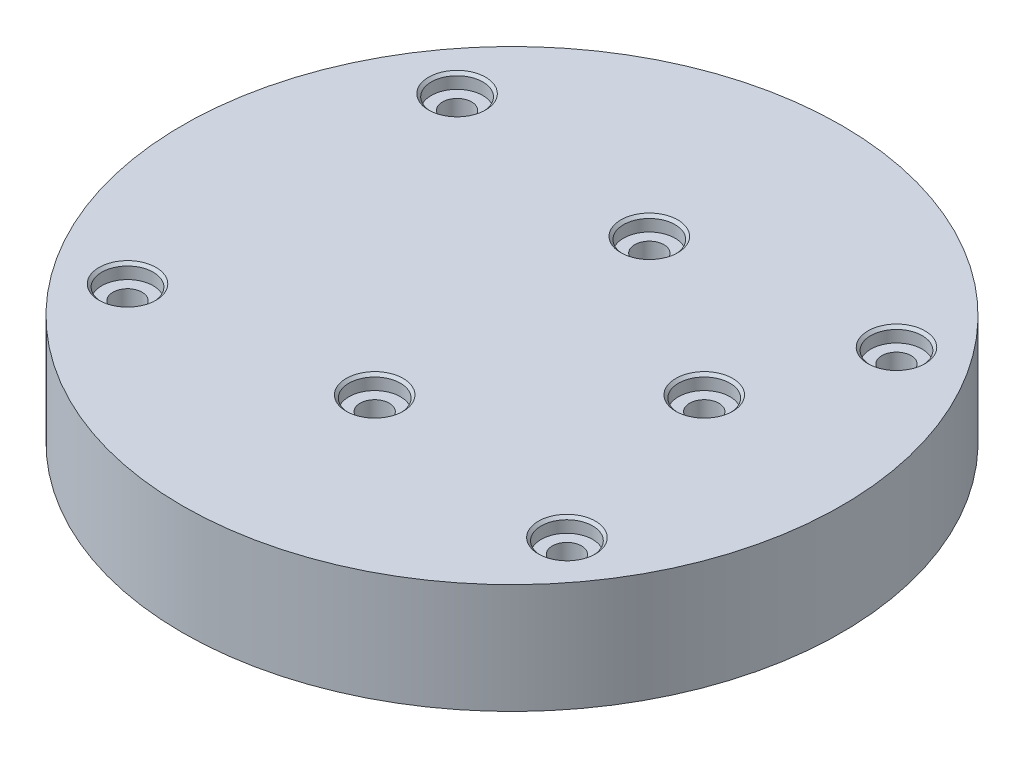
ISO-10303-21;
HEADER;
FILE_DESCRIPTION(('STEP AP214'),'2;1');
FILE_NAME('part.step','',(''),(''),'','','');
FILE_SCHEMA(('AUTOMOTIVE_DESIGN { 1 0 10303 214 1 1 1 1 }'));
ENDSEC;
DATA;
#1=APPLICATION_CONTEXT('core data for automotive mechanical design processes');
#2=APPLICATION_PROTOCOL_DEFINITION('international standard','automotive_design',2000,#1);
#3=PRODUCT_CONTEXT('',#1,'mechanical');
#4=PRODUCT('Part','Part','',(#3));
#5=PRODUCT_RELATED_PRODUCT_CATEGORY('part','',(#4));
#6=PRODUCT_DEFINITION_FORMATION('','',#4);
#7=PRODUCT_DEFINITION_CONTEXT('part definition',#1,'design');
#8=PRODUCT_DEFINITION('design','',#6,#7);
#9=PRODUCT_DEFINITION_SHAPE('','',#8);
#10=(LENGTH_UNIT() NAMED_UNIT(*) SI_UNIT(.MILLI.,.METRE.));
#11=(NAMED_UNIT(*) PLANE_ANGLE_UNIT() SI_UNIT($,.RADIAN.));
#12=(NAMED_UNIT(*) SI_UNIT($,.STERADIAN.) SOLID_ANGLE_UNIT());
#13=UNCERTAINTY_MEASURE_WITH_UNIT(LENGTH_MEASURE(1.E-05),#10,'distance_accuracy_value','');
#14=(GEOMETRIC_REPRESENTATION_CONTEXT(3) GLOBAL_UNCERTAINTY_ASSIGNED_CONTEXT((#13)) GLOBAL_UNIT_ASSIGNED_CONTEXT((#10,
#11,#12)) REPRESENTATION_CONTEXT('',''));
#15=CARTESIAN_POINT('',(0.,0.,0.));
#16=DIRECTION('',(0.,0.,1.));
#17=DIRECTION('',(1.,0.,0.));
#18=AXIS2_PLACEMENT_3D('',#15,#16,#17);
#19=CARTESIAN_POINT('',(0.,-25.4,0.));
#20=DIRECTION('',(0.,1.,0.));
#21=DIRECTION('',(0.,0.,1.));
#22=AXIS2_PLACEMENT_3D('',#19,#20,#21);
#23=CYLINDRICAL_SURFACE('',#22,76.2);
#24=CARTESIAN_POINT('',(0.,-25.4,0.));
#25=DIRECTION('',(0.,1.,0.));
#26=DIRECTION('',(0.,0.,1.));
#27=AXIS2_PLACEMENT_3D('',#24,#25,#26);
#28=CIRCLE('',#27,76.2);
#29=CARTESIAN_POINT('',(0.,-25.4,76.2));
#30=VERTEX_POINT('',#29);
#31=EDGE_CURVE('E10',#30,#30,#28,.T.);
#32=ORIENTED_EDGE('',*,*,#31,.T.);
#33=EDGE_LOOP('',(#32));
#34=FACE_BOUND('',#33,.T.);
#35=CARTESIAN_POINT('',(0.,0.,0.));
#36=DIRECTION('',(0.,1.,0.));
#37=DIRECTION('',(0.,0.,1.));
#38=AXIS2_PLACEMENT_3D('',#35,#36,#37);
#39=CIRCLE('',#38,76.2);
#40=CARTESIAN_POINT('',(0.,0.,76.2));
#41=VERTEX_POINT('',#40);
#42=EDGE_CURVE('E38',#41,#41,#39,.T.);
#43=ORIENTED_EDGE('',*,*,#42,.F.);
#44=EDGE_LOOP('',(#43));
#45=FACE_BOUND('',#44,.T.);
#46=ADVANCED_FACE('F35',(#34,#45),#23,.T.);
#47=CARTESIAN_POINT('',(0.,-25.4,0.));
#48=DIRECTION('',(0.,1.,0.));
#49=DIRECTION('',(0.,0.,1.));
#50=AXIS2_PLACEMENT_3D('',#47,#48,#49);
#51=PLANE('',#50);
#52=CARTESIAN_POINT('',(0.,-25.4,-31.75));
#53=DIRECTION('',(0.,1.,0.));
#54=DIRECTION('',(0.,0.,1.));
#55=AXIS2_PLACEMENT_3D('',#52,#53,#54);
#56=CIRCLE('',#55,3.3782);
#57=CARTESIAN_POINT('',(0.,-25.4,-28.3718));
#58=VERTEX_POINT('',#57);
#59=EDGE_CURVE('E136',#58,#58,#56,.T.);
#60=ORIENTED_EDGE('',*,*,#59,.T.);
#61=EDGE_LOOP('',(#60));
#62=FACE_BOUND('',#61,.T.);
#63=CARTESIAN_POINT('',(38.1,-25.4,-6.35));
#64=DIRECTION('',(0.,1.,0.));
#65=DIRECTION('',(0.,0.,1.));
#66=AXIS2_PLACEMENT_3D('',#63,#64,#65);
#67=CIRCLE('',#66,3.3782);
#68=CARTESIAN_POINT('',(38.1,-25.4,-2.9718));
#69=VERTEX_POINT('',#68);
#70=EDGE_CURVE('E121',#69,#69,#67,.T.);
#71=ORIENTED_EDGE('',*,*,#70,.T.);
#72=EDGE_LOOP('',(#71));
#73=FACE_BOUND('',#72,.T.);
#74=CARTESIAN_POINT('',(0.,-25.4,31.75));
#75=DIRECTION('',(0.,1.,0.));
#76=DIRECTION('',(0.,0.,1.));
#77=AXIS2_PLACEMENT_3D('',#74,#75,#76);
#78=CIRCLE('',#77,3.3782);
#79=CARTESIAN_POINT('',(0.,-25.4,35.1282));
#80=VERTEX_POINT('',#79);
#81=EDGE_CURVE('E106',#80,#80,#78,.T.);
#82=ORIENTED_EDGE('',*,*,#81,.T.);
#83=EDGE_LOOP('',(#82));
#84=FACE_BOUND('',#83,.T.);
#85=CARTESIAN_POINT('',(50.8,-25.4,38.1));
#86=DIRECTION('',(0.,1.,0.));
#87=DIRECTION('',(0.,0.,1.));
#88=AXIS2_PLACEMENT_3D('',#85,#86,#87);
#89=CIRCLE('',#88,3.3782);
#90=CARTESIAN_POINT('',(50.8,-25.4,41.4782));
#91=VERTEX_POINT('',#90);
#92=EDGE_CURVE('E91',#91,#91,#89,.T.);
#93=ORIENTED_EDGE('',*,*,#92,.T.);
#94=EDGE_LOOP('',(#93));
#95=FACE_BOUND('',#94,.T.);
#96=CARTESIAN_POINT('',(50.8,-25.4,-38.1));
#97=DIRECTION('',(0.,1.,0.));
#98=DIRECTION('',(0.,0.,1.));
#99=AXIS2_PLACEMENT_3D('',#96,#97,#98);
#100=CIRCLE('',#99,3.3782);
#101=CARTESIAN_POINT('',(50.8,-25.4,-34.7218));
#102=VERTEX_POINT('',#101);
#103=EDGE_CURVE('E76',#102,#102,#100,.T.);
#104=ORIENTED_EDGE('',*,*,#103,.T.);
#105=EDGE_LOOP('',(#104));
#106=FACE_BOUND('',#105,.T.);
#107=CARTESIAN_POINT('',(-50.8,-25.4,-38.1));
#108=DIRECTION('',(0.,1.,0.));
#109=DIRECTION('',(0.,0.,1.));
#110=AXIS2_PLACEMENT_3D('',#107,#108,#109);
#111=CIRCLE('',#110,3.3782);
#112=CARTESIAN_POINT('',(-50.8,-25.4,-34.7218));
#113=VERTEX_POINT('',#112);
#114=EDGE_CURVE('E61',#113,#113,#111,.T.);
#115=ORIENTED_EDGE('',*,*,#114,.T.);
#116=EDGE_LOOP('',(#115));
#117=FACE_BOUND('',#116,.T.);
#118=CARTESIAN_POINT('',(-50.8,-25.4,38.1));
#119=DIRECTION('',(0.,1.,0.));
#120=DIRECTION('',(0.,0.,1.));
#121=AXIS2_PLACEMENT_3D('',#118,#119,#120);
#122=CIRCLE('',#121,3.3782);
#123=CARTESIAN_POINT('',(-50.8,-25.4,41.4782));
#124=VERTEX_POINT('',#123);
#125=EDGE_CURVE('E45',#124,#124,#122,.T.);
#126=ORIENTED_EDGE('',*,*,#125,.T.);
#127=EDGE_LOOP('',(#126));
#128=FACE_BOUND('',#127,.T.);
#129=ORIENTED_EDGE('',*,*,#31,.F.);
#130=EDGE_LOOP('',(#129));
#131=FACE_BOUND('',#130,.T.);
#132=ADVANCED_FACE('F158',(#62,#73,#84,#95,#106,#117,#128,#131),#51,.F.);
#133=CARTESIAN_POINT('',(0.,0.,0.));
#134=DIRECTION('',(0.,1.,0.));
#135=DIRECTION('',(0.,0.,1.));
#136=AXIS2_PLACEMENT_3D('',#133,#134,#135);
#137=PLANE('',#136);
#138=CARTESIAN_POINT('',(0.,0.,-31.75));
#139=DIRECTION('',(0.,1.,0.));
#140=DIRECTION('',(0.,0.,1.));
#141=AXIS2_PLACEMENT_3D('',#138,#139,#140);
#142=CIRCLE('',#141,6.58876);
#143=CARTESIAN_POINT('',(0.,0.,-25.16124));
#144=VERTEX_POINT('',#143);
#145=EDGE_CURVE('E148',#144,#144,#142,.T.);
#146=ORIENTED_EDGE('',*,*,#145,.F.);
#147=EDGE_LOOP('',(#146));
#148=FACE_BOUND('',#147,.T.);
#149=CARTESIAN_POINT('',(38.1,0.,-6.35));
#150=DIRECTION('',(0.,1.,0.));
#151=DIRECTION('',(0.,0.,1.));
#152=AXIS2_PLACEMENT_3D('',#149,#150,#151);
#153=CIRCLE('',#152,6.58876);
#154=CARTESIAN_POINT('',(38.1,0.,0.238759999999998));
#155=VERTEX_POINT('',#154);
#156=EDGE_CURVE('E133',#155,#155,#153,.T.);
#157=ORIENTED_EDGE('',*,*,#156,.F.);
#158=EDGE_LOOP('',(#157));
#159=FACE_BOUND('',#158,.T.);
#160=CARTESIAN_POINT('',(0.,0.,31.75));
#161=DIRECTION('',(0.,1.,0.));
#162=DIRECTION('',(0.,0.,1.));
#163=AXIS2_PLACEMENT_3D('',#160,#161,#162);
#164=CIRCLE('',#163,6.58876);
#165=CARTESIAN_POINT('',(0.,0.,38.33876));
#166=VERTEX_POINT('',#165);
#167=EDGE_CURVE('E118',#166,#166,#164,.T.);
#168=ORIENTED_EDGE('',*,*,#167,.F.);
#169=EDGE_LOOP('',(#168));
#170=FACE_BOUND('',#169,.T.);
#171=CARTESIAN_POINT('',(50.8,0.,38.1));
#172=DIRECTION('',(0.,1.,0.));
#173=DIRECTION('',(0.,0.,1.));
#174=AXIS2_PLACEMENT_3D('',#171,#172,#173);
#175=CIRCLE('',#174,6.58876);
#176=CARTESIAN_POINT('',(50.8,0.,44.68876));
#177=VERTEX_POINT('',#176);
#178=EDGE_CURVE('E103',#177,#177,#175,.T.);
#179=ORIENTED_EDGE('',*,*,#178,.F.);
#180=EDGE_LOOP('',(#179));
#181=FACE_BOUND('',#180,.T.);
#182=CARTESIAN_POINT('',(50.8,0.,-38.1));
#183=DIRECTION('',(0.,1.,0.));
#184=DIRECTION('',(0.,0.,1.));
#185=AXIS2_PLACEMENT_3D('',#182,#183,#184);
#186=CIRCLE('',#185,6.58876);
#187=CARTESIAN_POINT('',(50.8,0.,-31.51124));
#188=VERTEX_POINT('',#187);
#189=EDGE_CURVE('E88',#188,#188,#186,.T.);
#190=ORIENTED_EDGE('',*,*,#189,.F.);
#191=EDGE_LOOP('',(#190));
#192=FACE_BOUND('',#191,.T.);
#193=CARTESIAN_POINT('',(-50.8,0.,-38.1));
#194=DIRECTION('',(0.,1.,0.));
#195=DIRECTION('',(0.,0.,1.));
#196=AXIS2_PLACEMENT_3D('',#193,#194,#195);
#197=CIRCLE('',#196,6.58876);
#198=CARTESIAN_POINT('',(-50.8,0.,-31.51124));
#199=VERTEX_POINT('',#198);
#200=EDGE_CURVE('E73',#199,#199,#197,.T.);
#201=ORIENTED_EDGE('',*,*,#200,.F.);
#202=EDGE_LOOP('',(#201));
#203=FACE_BOUND('',#202,.T.);
#204=CARTESIAN_POINT('',(-50.8,0.,38.1));
#205=DIRECTION('',(0.,1.,0.));
#206=DIRECTION('',(0.,0.,1.));
#207=AXIS2_PLACEMENT_3D('',#204,#205,#206);
#208=CIRCLE('',#207,6.58876);
#209=CARTESIAN_POINT('',(-50.8,0.,44.68876));
#210=VERTEX_POINT('',#209);
#211=EDGE_CURVE('E58',#210,#210,#208,.T.);
#212=ORIENTED_EDGE('',*,*,#211,.F.);
#213=EDGE_LOOP('',(#212));
#214=FACE_BOUND('',#213,.T.);
#215=ORIENTED_EDGE('',*,*,#42,.T.);
#216=EDGE_LOOP('',(#215));
#217=FACE_BOUND('',#216,.T.);
#218=ADVANCED_FACE('F154',(#148,#159,#170,#181,#192,#203,#214,#217),#137,.T.);
#219=CARTESIAN_POINT('',(-50.8,0.,38.1));
#220=DIRECTION('',(0.,1.,0.));
#221=DIRECTION('',(0.,0.,1.));
#222=AXIS2_PLACEMENT_3D('',#219,#220,#221);
#223=CYLINDRICAL_SURFACE('',#222,3.3782);
#224=ORIENTED_EDGE('',*,*,#125,.F.);
#225=EDGE_LOOP('',(#224));
#226=FACE_BOUND('',#225,.T.);
#227=CARTESIAN_POINT('',(-50.8,-3.3528,38.1));
#228=DIRECTION('',(0.,1.,0.));
#229=DIRECTION('',(0.,0.,1.));
#230=AXIS2_PLACEMENT_3D('',#227,#228,#229);
#231=CIRCLE('',#230,3.3782);
#232=CARTESIAN_POINT('',(-50.8,-3.3528,41.4782));
#233=VERTEX_POINT('',#232);
#234=EDGE_CURVE('E49',#233,#233,#231,.T.);
#235=ORIENTED_EDGE('',*,*,#234,.T.);
#236=EDGE_LOOP('',(#235));
#237=FACE_BOUND('',#236,.T.);
#238=ADVANCED_FACE('F157',(#226,#237),#223,.F.);
#239=CARTESIAN_POINT('',(-44.84624,-3.3528,38.1));
#240=DIRECTION('',(0.,-1.,0.));
#241=DIRECTION('',(0.,0.,-1.));
#242=AXIS2_PLACEMENT_3D('',#239,#240,#241);
#243=PLANE('',#242);
#244=ORIENTED_EDGE('',*,*,#234,.F.);
#245=EDGE_LOOP('',(#244));
#246=FACE_BOUND('',#245,.T.);
#247=CARTESIAN_POINT('',(-50.8,-3.3528,38.1));
#248=DIRECTION('',(0.,1.,0.));
#249=DIRECTION('',(0.,0.,1.));
#250=AXIS2_PLACEMENT_3D('',#247,#248,#249);
#251=CIRCLE('',#250,5.95376);
#252=CARTESIAN_POINT('',(-50.8,-3.3528,44.05376));
#253=VERTEX_POINT('',#252);
#254=EDGE_CURVE('E52',#253,#253,#251,.T.);
#255=ORIENTED_EDGE('',*,*,#254,.T.);
#256=EDGE_LOOP('',(#255));
#257=FACE_BOUND('',#256,.T.);
#258=ADVANCED_FACE('F185',(#246,#257),#243,.F.);
#259=CARTESIAN_POINT('',(-50.8,0.,38.1));
#260=DIRECTION('',(0.,1.,0.));
#261=DIRECTION('',(0.,0.,1.));
#262=AXIS2_PLACEMENT_3D('',#259,#260,#261);
#263=CYLINDRICAL_SURFACE('',#262,5.95376);
#264=ORIENTED_EDGE('',*,*,#254,.F.);
#265=EDGE_LOOP('',(#264));
#266=FACE_BOUND('',#265,.T.);
#267=CARTESIAN_POINT('',(-50.8,-0.635000000000002,38.1));
#268=DIRECTION('',(0.,1.,0.));
#269=DIRECTION('',(0.,0.,1.));
#270=AXIS2_PLACEMENT_3D('',#267,#268,#269);
#271=CIRCLE('',#270,5.95376);
#272=CARTESIAN_POINT('',(-50.8,-0.635000000000002,44.05376));
#273=VERTEX_POINT('',#272);
#274=EDGE_CURVE('E55',#273,#273,#271,.T.);
#275=ORIENTED_EDGE('',*,*,#274,.T.);
#276=EDGE_LOOP('',(#275));
#277=FACE_BOUND('',#276,.T.);
#278=ADVANCED_FACE('F189',(#266,#277),#263,.F.);
#279=CARTESIAN_POINT('',(-50.8,0.,38.1));
#280=DIRECTION('',(0.,1.,0.));
#281=DIRECTION('',(0.,0.,1.));
#282=AXIS2_PLACEMENT_3D('',#279,#280,#281);
#283=CONICAL_SURFACE('',#282,6.58876,0.785398163397444);
#284=ORIENTED_EDGE('',*,*,#274,.F.);
#285=EDGE_LOOP('',(#284));
#286=FACE_BOUND('',#285,.T.);
#287=ORIENTED_EDGE('',*,*,#211,.T.);
#288=EDGE_LOOP('',(#287));
#289=FACE_BOUND('',#288,.T.);
#290=ADVANCED_FACE('F193',(#286,#289),#283,.F.);
#291=CARTESIAN_POINT('',(-50.8,0.,-38.1));
#292=DIRECTION('',(0.,1.,0.));
#293=DIRECTION('',(0.,0.,1.));
#294=AXIS2_PLACEMENT_3D('',#291,#292,#293);
#295=CYLINDRICAL_SURFACE('',#294,3.3782);
#296=ORIENTED_EDGE('',*,*,#114,.F.);
#297=EDGE_LOOP('',(#296));
#298=FACE_BOUND('',#297,.T.);
#299=CARTESIAN_POINT('',(-50.8,-3.3528,-38.1));
#300=DIRECTION('',(0.,1.,0.));
#301=DIRECTION('',(0.,0.,1.));
#302=AXIS2_PLACEMENT_3D('',#299,#300,#301);
#303=CIRCLE('',#302,3.3782);
#304=CARTESIAN_POINT('',(-50.8,-3.3528,-34.7218));
#305=VERTEX_POINT('',#304);
#306=EDGE_CURVE('E64',#305,#305,#303,.T.);
#307=ORIENTED_EDGE('',*,*,#306,.T.);
#308=EDGE_LOOP('',(#307));
#309=FACE_BOUND('',#308,.T.);
#310=ADVANCED_FACE('F197',(#298,#309),#295,.F.);
#311=CARTESIAN_POINT('',(-44.84624,-3.3528,-38.1));
#312=DIRECTION('',(0.,-1.,0.));
#313=DIRECTION('',(0.,0.,-1.));
#314=AXIS2_PLACEMENT_3D('',#311,#312,#313);
#315=PLANE('',#314);
#316=ORIENTED_EDGE('',*,*,#306,.F.);
#317=EDGE_LOOP('',(#316));
#318=FACE_BOUND('',#317,.T.);
#319=CARTESIAN_POINT('',(-50.8,-3.3528,-38.1));
#320=DIRECTION('',(0.,1.,0.));
#321=DIRECTION('',(0.,0.,1.));
#322=AXIS2_PLACEMENT_3D('',#319,#320,#321);
#323=CIRCLE('',#322,5.95376);
#324=CARTESIAN_POINT('',(-50.8,-3.3528,-32.14624));
#325=VERTEX_POINT('',#324);
#326=EDGE_CURVE('E67',#325,#325,#323,.T.);
#327=ORIENTED_EDGE('',*,*,#326,.T.);
#328=EDGE_LOOP('',(#327));
#329=FACE_BOUND('',#328,.T.);
#330=ADVANCED_FACE('F201',(#318,#329),#315,.F.);
#331=CARTESIAN_POINT('',(-50.8,0.,-38.1));
#332=DIRECTION('',(0.,1.,0.));
#333=DIRECTION('',(0.,0.,1.));
#334=AXIS2_PLACEMENT_3D('',#331,#332,#333);
#335=CYLINDRICAL_SURFACE('',#334,5.95376);
#336=ORIENTED_EDGE('',*,*,#326,.F.);
#337=EDGE_LOOP('',(#336));
#338=FACE_BOUND('',#337,.T.);
#339=CARTESIAN_POINT('',(-50.8,-0.635000000000002,-38.1));
#340=DIRECTION('',(0.,1.,0.));
#341=DIRECTION('',(0.,0.,1.));
#342=AXIS2_PLACEMENT_3D('',#339,#340,#341);
#343=CIRCLE('',#342,5.95376);
#344=CARTESIAN_POINT('',(-50.8,-0.635000000000002,-32.14624));
#345=VERTEX_POINT('',#344);
#346=EDGE_CURVE('E70',#345,#345,#343,.T.);
#347=ORIENTED_EDGE('',*,*,#346,.T.);
#348=EDGE_LOOP('',(#347));
#349=FACE_BOUND('',#348,.T.);
#350=ADVANCED_FACE('F205',(#338,#349),#335,.F.);
#351=CARTESIAN_POINT('',(-50.8,0.,-38.1));
#352=DIRECTION('',(0.,1.,0.));
#353=DIRECTION('',(0.,0.,1.));
#354=AXIS2_PLACEMENT_3D('',#351,#352,#353);
#355=CONICAL_SURFACE('',#354,6.58876,0.785398163397444);
#356=ORIENTED_EDGE('',*,*,#346,.F.);
#357=EDGE_LOOP('',(#356));
#358=FACE_BOUND('',#357,.T.);
#359=ORIENTED_EDGE('',*,*,#200,.T.);
#360=EDGE_LOOP('',(#359));
#361=FACE_BOUND('',#360,.T.);
#362=ADVANCED_FACE('F209',(#358,#361),#355,.F.);
#363=CARTESIAN_POINT('',(50.8,0.,-38.1));
#364=DIRECTION('',(0.,1.,0.));
#365=DIRECTION('',(0.,0.,1.));
#366=AXIS2_PLACEMENT_3D('',#363,#364,#365);
#367=CYLINDRICAL_SURFACE('',#366,3.3782);
#368=ORIENTED_EDGE('',*,*,#103,.F.);
#369=EDGE_LOOP('',(#368));
#370=FACE_BOUND('',#369,.T.);
#371=CARTESIAN_POINT('',(50.8,-3.3528,-38.1));
#372=DIRECTION('',(0.,1.,0.));
#373=DIRECTION('',(0.,0.,1.));
#374=AXIS2_PLACEMENT_3D('',#371,#372,#373);
#375=CIRCLE('',#374,3.3782);
#376=CARTESIAN_POINT('',(50.8,-3.3528,-34.7218));
#377=VERTEX_POINT('',#376);
#378=EDGE_CURVE('E79',#377,#377,#375,.T.);
#379=ORIENTED_EDGE('',*,*,#378,.T.);
#380=EDGE_LOOP('',(#379));
#381=FACE_BOUND('',#380,.T.);
#382=ADVANCED_FACE('F213',(#370,#381),#367,.F.);
#383=CARTESIAN_POINT('',(56.75376,-3.3528,-38.1));
#384=DIRECTION('',(0.,-1.,0.));
#385=DIRECTION('',(0.,0.,-1.));
#386=AXIS2_PLACEMENT_3D('',#383,#384,#385);
#387=PLANE('',#386);
#388=ORIENTED_EDGE('',*,*,#378,.F.);
#389=EDGE_LOOP('',(#388));
#390=FACE_BOUND('',#389,.T.);
#391=CARTESIAN_POINT('',(50.8,-3.3528,-38.1));
#392=DIRECTION('',(0.,1.,0.));
#393=DIRECTION('',(0.,0.,1.));
#394=AXIS2_PLACEMENT_3D('',#391,#392,#393);
#395=CIRCLE('',#394,5.95376);
#396=CARTESIAN_POINT('',(50.8,-3.3528,-32.14624));
#397=VERTEX_POINT('',#396);
#398=EDGE_CURVE('E82',#397,#397,#395,.T.);
#399=ORIENTED_EDGE('',*,*,#398,.T.);
#400=EDGE_LOOP('',(#399));
#401=FACE_BOUND('',#400,.T.);
#402=ADVANCED_FACE('F217',(#390,#401),#387,.F.);
#403=CARTESIAN_POINT('',(50.8,0.,-38.1));
#404=DIRECTION('',(0.,1.,0.));
#405=DIRECTION('',(0.,0.,1.));
#406=AXIS2_PLACEMENT_3D('',#403,#404,#405);
#407=CYLINDRICAL_SURFACE('',#406,5.95376);
#408=ORIENTED_EDGE('',*,*,#398,.F.);
#409=EDGE_LOOP('',(#408));
#410=FACE_BOUND('',#409,.T.);
#411=CARTESIAN_POINT('',(50.8,-0.635000000000002,-38.1));
#412=DIRECTION('',(0.,1.,0.));
#413=DIRECTION('',(0.,0.,1.));
#414=AXIS2_PLACEMENT_3D('',#411,#412,#413);
#415=CIRCLE('',#414,5.95376);
#416=CARTESIAN_POINT('',(50.8,-0.635000000000002,-32.14624));
#417=VERTEX_POINT('',#416);
#418=EDGE_CURVE('E85',#417,#417,#415,.T.);
#419=ORIENTED_EDGE('',*,*,#418,.T.);
#420=EDGE_LOOP('',(#419));
#421=FACE_BOUND('',#420,.T.);
#422=ADVANCED_FACE('F221',(#410,#421),#407,.F.);
#423=CARTESIAN_POINT('',(50.8,0.,-38.1));
#424=DIRECTION('',(0.,1.,0.));
#425=DIRECTION('',(0.,0.,1.));
#426=AXIS2_PLACEMENT_3D('',#423,#424,#425);
#427=CONICAL_SURFACE('',#426,6.58876,0.785398163397444);
#428=ORIENTED_EDGE('',*,*,#418,.F.);
#429=EDGE_LOOP('',(#428));
#430=FACE_BOUND('',#429,.T.);
#431=ORIENTED_EDGE('',*,*,#189,.T.);
#432=EDGE_LOOP('',(#431));
#433=FACE_BOUND('',#432,.T.);
#434=ADVANCED_FACE('F225',(#430,#433),#427,.F.);
#435=CARTESIAN_POINT('',(50.8,0.,38.1));
#436=DIRECTION('',(0.,1.,0.));
#437=DIRECTION('',(0.,0.,1.));
#438=AXIS2_PLACEMENT_3D('',#435,#436,#437);
#439=CYLINDRICAL_SURFACE('',#438,3.3782);
#440=ORIENTED_EDGE('',*,*,#92,.F.);
#441=EDGE_LOOP('',(#440));
#442=FACE_BOUND('',#441,.T.);
#443=CARTESIAN_POINT('',(50.8,-3.3528,38.1));
#444=DIRECTION('',(0.,1.,0.));
#445=DIRECTION('',(0.,0.,1.));
#446=AXIS2_PLACEMENT_3D('',#443,#444,#445);
#447=CIRCLE('',#446,3.3782);
#448=CARTESIAN_POINT('',(50.8,-3.3528,41.4782));
#449=VERTEX_POINT('',#448);
#450=EDGE_CURVE('E94',#449,#449,#447,.T.);
#451=ORIENTED_EDGE('',*,*,#450,.T.);
#452=EDGE_LOOP('',(#451));
#453=FACE_BOUND('',#452,.T.);
#454=ADVANCED_FACE('F229',(#442,#453),#439,.F.);
#455=CARTESIAN_POINT('',(56.75376,-3.3528,38.1));
#456=DIRECTION('',(0.,-1.,0.));
#457=DIRECTION('',(0.,0.,-1.));
#458=AXIS2_PLACEMENT_3D('',#455,#456,#457);
#459=PLANE('',#458);
#460=ORIENTED_EDGE('',*,*,#450,.F.);
#461=EDGE_LOOP('',(#460));
#462=FACE_BOUND('',#461,.T.);
#463=CARTESIAN_POINT('',(50.8,-3.3528,38.1));
#464=DIRECTION('',(0.,1.,0.));
#465=DIRECTION('',(0.,0.,1.));
#466=AXIS2_PLACEMENT_3D('',#463,#464,#465);
#467=CIRCLE('',#466,5.95376);
#468=CARTESIAN_POINT('',(50.8,-3.3528,44.05376));
#469=VERTEX_POINT('',#468);
#470=EDGE_CURVE('E97',#469,#469,#467,.T.);
#471=ORIENTED_EDGE('',*,*,#470,.T.);
#472=EDGE_LOOP('',(#471));
#473=FACE_BOUND('',#472,.T.);
#474=ADVANCED_FACE('F233',(#462,#473),#459,.F.);
#475=CARTESIAN_POINT('',(50.8,0.,38.1));
#476=DIRECTION('',(0.,1.,0.));
#477=DIRECTION('',(0.,0.,1.));
#478=AXIS2_PLACEMENT_3D('',#475,#476,#477);
#479=CYLINDRICAL_SURFACE('',#478,5.95376);
#480=ORIENTED_EDGE('',*,*,#470,.F.);
#481=EDGE_LOOP('',(#480));
#482=FACE_BOUND('',#481,.T.);
#483=CARTESIAN_POINT('',(50.8,-0.635000000000002,38.1));
#484=DIRECTION('',(0.,1.,0.));
#485=DIRECTION('',(0.,0.,1.));
#486=AXIS2_PLACEMENT_3D('',#483,#484,#485);
#487=CIRCLE('',#486,5.95376);
#488=CARTESIAN_POINT('',(50.8,-0.635000000000002,44.05376));
#489=VERTEX_POINT('',#488);
#490=EDGE_CURVE('E100',#489,#489,#487,.T.);
#491=ORIENTED_EDGE('',*,*,#490,.T.);
#492=EDGE_LOOP('',(#491));
#493=FACE_BOUND('',#492,.T.);
#494=ADVANCED_FACE('F237',(#482,#493),#479,.F.);
#495=CARTESIAN_POINT('',(50.8,0.,38.1));
#496=DIRECTION('',(0.,1.,0.));
#497=DIRECTION('',(0.,0.,1.));
#498=AXIS2_PLACEMENT_3D('',#495,#496,#497);
#499=CONICAL_SURFACE('',#498,6.58876,0.785398163397444);
#500=ORIENTED_EDGE('',*,*,#490,.F.);
#501=EDGE_LOOP('',(#500));
#502=FACE_BOUND('',#501,.T.);
#503=ORIENTED_EDGE('',*,*,#178,.T.);
#504=EDGE_LOOP('',(#503));
#505=FACE_BOUND('',#504,.T.);
#506=ADVANCED_FACE('F241',(#502,#505),#499,.F.);
#507=CARTESIAN_POINT('',(0.,0.,31.75));
#508=DIRECTION('',(0.,1.,0.));
#509=DIRECTION('',(0.,0.,1.));
#510=AXIS2_PLACEMENT_3D('',#507,#508,#509);
#511=CYLINDRICAL_SURFACE('',#510,3.3782);
#512=ORIENTED_EDGE('',*,*,#81,.F.);
#513=EDGE_LOOP('',(#512));
#514=FACE_BOUND('',#513,.T.);
#515=CARTESIAN_POINT('',(0.,-3.3528,31.75));
#516=DIRECTION('',(0.,1.,0.));
#517=DIRECTION('',(0.,0.,1.));
#518=AXIS2_PLACEMENT_3D('',#515,#516,#517);
#519=CIRCLE('',#518,3.3782);
#520=CARTESIAN_POINT('',(0.,-3.3528,35.1282));
#521=VERTEX_POINT('',#520);
#522=EDGE_CURVE('E109',#521,#521,#519,.T.);
#523=ORIENTED_EDGE('',*,*,#522,.T.);
#524=EDGE_LOOP('',(#523));
#525=FACE_BOUND('',#524,.T.);
#526=ADVANCED_FACE('F245',(#514,#525),#511,.F.);
#527=CARTESIAN_POINT('',(5.95376000000001,-3.3528,31.75));
#528=DIRECTION('',(0.,-1.,0.));
#529=DIRECTION('',(0.,0.,-1.));
#530=AXIS2_PLACEMENT_3D('',#527,#528,#529);
#531=PLANE('',#530);
#532=ORIENTED_EDGE('',*,*,#522,.F.);
#533=EDGE_LOOP('',(#532));
#534=FACE_BOUND('',#533,.T.);
#535=CARTESIAN_POINT('',(0.,-3.3528,31.75));
#536=DIRECTION('',(0.,1.,0.));
#537=DIRECTION('',(0.,0.,1.));
#538=AXIS2_PLACEMENT_3D('',#535,#536,#537);
#539=CIRCLE('',#538,5.95376);
#540=CARTESIAN_POINT('',(0.,-3.3528,37.70376));
#541=VERTEX_POINT('',#540);
#542=EDGE_CURVE('E112',#541,#541,#539,.T.);
#543=ORIENTED_EDGE('',*,*,#542,.T.);
#544=EDGE_LOOP('',(#543));
#545=FACE_BOUND('',#544,.T.);
#546=ADVANCED_FACE('F249',(#534,#545),#531,.F.);
#547=CARTESIAN_POINT('',(0.,0.,31.75));
#548=DIRECTION('',(0.,1.,0.));
#549=DIRECTION('',(0.,0.,1.));
#550=AXIS2_PLACEMENT_3D('',#547,#548,#549);
#551=CYLINDRICAL_SURFACE('',#550,5.95376);
#552=ORIENTED_EDGE('',*,*,#542,.F.);
#553=EDGE_LOOP('',(#552));
#554=FACE_BOUND('',#553,.T.);
#555=CARTESIAN_POINT('',(0.,-0.635000000000002,31.75));
#556=DIRECTION('',(0.,1.,0.));
#557=DIRECTION('',(0.,0.,1.));
#558=AXIS2_PLACEMENT_3D('',#555,#556,#557);
#559=CIRCLE('',#558,5.95376);
#560=CARTESIAN_POINT('',(0.,-0.635000000000002,37.70376));
#561=VERTEX_POINT('',#560);
#562=EDGE_CURVE('E115',#561,#561,#559,.T.);
#563=ORIENTED_EDGE('',*,*,#562,.T.);
#564=EDGE_LOOP('',(#563));
#565=FACE_BOUND('',#564,.T.);
#566=ADVANCED_FACE('F253',(#554,#565),#551,.F.);
#567=CARTESIAN_POINT('',(0.,0.,31.75));
#568=DIRECTION('',(0.,1.,0.));
#569=DIRECTION('',(0.,0.,1.));
#570=AXIS2_PLACEMENT_3D('',#567,#568,#569);
#571=CONICAL_SURFACE('',#570,6.58876,0.785398163397448);
#572=ORIENTED_EDGE('',*,*,#562,.F.);
#573=EDGE_LOOP('',(#572));
#574=FACE_BOUND('',#573,.T.);
#575=ORIENTED_EDGE('',*,*,#167,.T.);
#576=EDGE_LOOP('',(#575));
#577=FACE_BOUND('',#576,.T.);
#578=ADVANCED_FACE('F257',(#574,#577),#571,.F.);
#579=CARTESIAN_POINT('',(38.1,0.,-6.35));
#580=DIRECTION('',(0.,1.,0.));
#581=DIRECTION('',(0.,0.,1.));
#582=AXIS2_PLACEMENT_3D('',#579,#580,#581);
#583=CYLINDRICAL_SURFACE('',#582,3.3782);
#584=ORIENTED_EDGE('',*,*,#70,.F.);
#585=EDGE_LOOP('',(#584));
#586=FACE_BOUND('',#585,.T.);
#587=CARTESIAN_POINT('',(38.1,-3.3528,-6.35));
#588=DIRECTION('',(0.,1.,0.));
#589=DIRECTION('',(0.,0.,1.));
#590=AXIS2_PLACEMENT_3D('',#587,#588,#589);
#591=CIRCLE('',#590,3.3782);
#592=CARTESIAN_POINT('',(38.1,-3.3528,-2.9718));
#593=VERTEX_POINT('',#592);
#594=EDGE_CURVE('E124',#593,#593,#591,.T.);
#595=ORIENTED_EDGE('',*,*,#594,.T.);
#596=EDGE_LOOP('',(#595));
#597=FACE_BOUND('',#596,.T.);
#598=ADVANCED_FACE('F261',(#586,#597),#583,.F.);
#599=CARTESIAN_POINT('',(44.05376,-3.3528,-6.35));
#600=DIRECTION('',(0.,-1.,0.));
#601=DIRECTION('',(0.,0.,-1.));
#602=AXIS2_PLACEMENT_3D('',#599,#600,#601);
#603=PLANE('',#602);
#604=ORIENTED_EDGE('',*,*,#594,.F.);
#605=EDGE_LOOP('',(#604));
#606=FACE_BOUND('',#605,.T.);
#607=CARTESIAN_POINT('',(38.1,-3.3528,-6.35));
#608=DIRECTION('',(0.,1.,0.));
#609=DIRECTION('',(0.,0.,1.));
#610=AXIS2_PLACEMENT_3D('',#607,#608,#609);
#611=CIRCLE('',#610,5.95376);
#612=CARTESIAN_POINT('',(38.1,-3.3528,-0.396240000000005));
#613=VERTEX_POINT('',#612);
#614=EDGE_CURVE('E127',#613,#613,#611,.T.);
#615=ORIENTED_EDGE('',*,*,#614,.T.);
#616=EDGE_LOOP('',(#615));
#617=FACE_BOUND('',#616,.T.);
#618=ADVANCED_FACE('F265',(#606,#617),#603,.F.);
#619=CARTESIAN_POINT('',(38.1,0.,-6.35));
#620=DIRECTION('',(0.,1.,0.));
#621=DIRECTION('',(0.,0.,1.));
#622=AXIS2_PLACEMENT_3D('',#619,#620,#621);
#623=CYLINDRICAL_SURFACE('',#622,5.95376);
#624=ORIENTED_EDGE('',*,*,#614,.F.);
#625=EDGE_LOOP('',(#624));
#626=FACE_BOUND('',#625,.T.);
#627=CARTESIAN_POINT('',(38.1,-0.635000000000002,-6.35));
#628=DIRECTION('',(0.,1.,0.));
#629=DIRECTION('',(0.,0.,1.));
#630=AXIS2_PLACEMENT_3D('',#627,#628,#629);
#631=CIRCLE('',#630,5.95376);
#632=CARTESIAN_POINT('',(38.1,-0.635000000000002,-0.396240000000005));
#633=VERTEX_POINT('',#632);
#634=EDGE_CURVE('E130',#633,#633,#631,.T.);
#635=ORIENTED_EDGE('',*,*,#634,.T.);
#636=EDGE_LOOP('',(#635));
#637=FACE_BOUND('',#636,.T.);
#638=ADVANCED_FACE('F269',(#626,#637),#623,.F.);
#639=CARTESIAN_POINT('',(38.1,0.,-6.35));
#640=DIRECTION('',(0.,1.,0.));
#641=DIRECTION('',(0.,0.,1.));
#642=AXIS2_PLACEMENT_3D('',#639,#640,#641);
#643=CONICAL_SURFACE('',#642,6.58876,0.785398163397449);
#644=ORIENTED_EDGE('',*,*,#634,.F.);
#645=EDGE_LOOP('',(#644));
#646=FACE_BOUND('',#645,.T.);
#647=ORIENTED_EDGE('',*,*,#156,.T.);
#648=EDGE_LOOP('',(#647));
#649=FACE_BOUND('',#648,.T.);
#650=ADVANCED_FACE('F273',(#646,#649),#643,.F.);
#651=CARTESIAN_POINT('',(0.,0.,-31.75));
#652=DIRECTION('',(0.,1.,0.));
#653=DIRECTION('',(0.,0.,1.));
#654=AXIS2_PLACEMENT_3D('',#651,#652,#653);
#655=CYLINDRICAL_SURFACE('',#654,3.3782);
#656=ORIENTED_EDGE('',*,*,#59,.F.);
#657=EDGE_LOOP('',(#656));
#658=FACE_BOUND('',#657,.T.);
#659=CARTESIAN_POINT('',(0.,-3.3528,-31.75));
#660=DIRECTION('',(0.,1.,0.));
#661=DIRECTION('',(0.,0.,1.));
#662=AXIS2_PLACEMENT_3D('',#659,#660,#661);
#663=CIRCLE('',#662,3.3782);
#664=CARTESIAN_POINT('',(0.,-3.3528,-28.3718));
#665=VERTEX_POINT('',#664);
#666=EDGE_CURVE('E139',#665,#665,#663,.T.);
#667=ORIENTED_EDGE('',*,*,#666,.T.);
#668=EDGE_LOOP('',(#667));
#669=FACE_BOUND('',#668,.T.);
#670=ADVANCED_FACE('F277',(#658,#669),#655,.F.);
#671=CARTESIAN_POINT('',(5.95376000000001,-3.3528,-31.75));
#672=DIRECTION('',(0.,-1.,0.));
#673=DIRECTION('',(0.,0.,-1.));
#674=AXIS2_PLACEMENT_3D('',#671,#672,#673);
#675=PLANE('',#674);
#676=ORIENTED_EDGE('',*,*,#666,.F.);
#677=EDGE_LOOP('',(#676));
#678=FACE_BOUND('',#677,.T.);
#679=CARTESIAN_POINT('',(0.,-3.3528,-31.75));
#680=DIRECTION('',(0.,1.,0.));
#681=DIRECTION('',(0.,0.,1.));
#682=AXIS2_PLACEMENT_3D('',#679,#680,#681);
#683=CIRCLE('',#682,5.95376);
#684=CARTESIAN_POINT('',(0.,-3.3528,-25.79624));
#685=VERTEX_POINT('',#684);
#686=EDGE_CURVE('E142',#685,#685,#683,.T.);
#687=ORIENTED_EDGE('',*,*,#686,.T.);
#688=EDGE_LOOP('',(#687));
#689=FACE_BOUND('',#688,.T.);
#690=ADVANCED_FACE('F281',(#678,#689),#675,.F.);
#691=CARTESIAN_POINT('',(0.,0.,-31.75));
#692=DIRECTION('',(0.,1.,0.));
#693=DIRECTION('',(0.,0.,1.));
#694=AXIS2_PLACEMENT_3D('',#691,#692,#693);
#695=CYLINDRICAL_SURFACE('',#694,5.95376);
#696=ORIENTED_EDGE('',*,*,#686,.F.);
#697=EDGE_LOOP('',(#696));
#698=FACE_BOUND('',#697,.T.);
#699=CARTESIAN_POINT('',(0.,-0.635000000000002,-31.75));
#700=DIRECTION('',(0.,1.,0.));
#701=DIRECTION('',(0.,0.,1.));
#702=AXIS2_PLACEMENT_3D('',#699,#700,#701);
#703=CIRCLE('',#702,5.95376);
#704=CARTESIAN_POINT('',(0.,-0.635000000000002,-25.79624));
#705=VERTEX_POINT('',#704);
#706=EDGE_CURVE('E145',#705,#705,#703,.T.);
#707=ORIENTED_EDGE('',*,*,#706,.T.);
#708=EDGE_LOOP('',(#707));
#709=FACE_BOUND('',#708,.T.);
#710=ADVANCED_FACE('F285',(#698,#709),#695,.F.);
#711=CARTESIAN_POINT('',(0.,0.,-31.75));
#712=DIRECTION('',(0.,1.,0.));
#713=DIRECTION('',(0.,0.,1.));
#714=AXIS2_PLACEMENT_3D('',#711,#712,#713);
#715=CONICAL_SURFACE('',#714,6.58876,0.785398163397447);
#716=ORIENTED_EDGE('',*,*,#706,.F.);
#717=EDGE_LOOP('',(#716));
#718=FACE_BOUND('',#717,.T.);
#719=ORIENTED_EDGE('',*,*,#145,.T.);
#720=EDGE_LOOP('',(#719));
#721=FACE_BOUND('',#720,.T.);
#722=ADVANCED_FACE('F152',(#718,#721),#715,.F.);
#723=CLOSED_SHELL('',(#46,#132,#218,#238,#258,#278,#290,#310,#330,#350,#362,#382,#402,#422,#434,
#454,#474,#494,#506,#526,#546,#566,#578,#598,#618,#638,#650,#670,#690,#710,#722));
#724=MANIFOLD_SOLID_BREP('B2',#723);
#725=ADVANCED_BREP_SHAPE_REPRESENTATION('',(#18,#724),#14);
#726=SHAPE_DEFINITION_REPRESENTATION(#9,#725);
ENDSEC;
END-ISO-10303-21;
